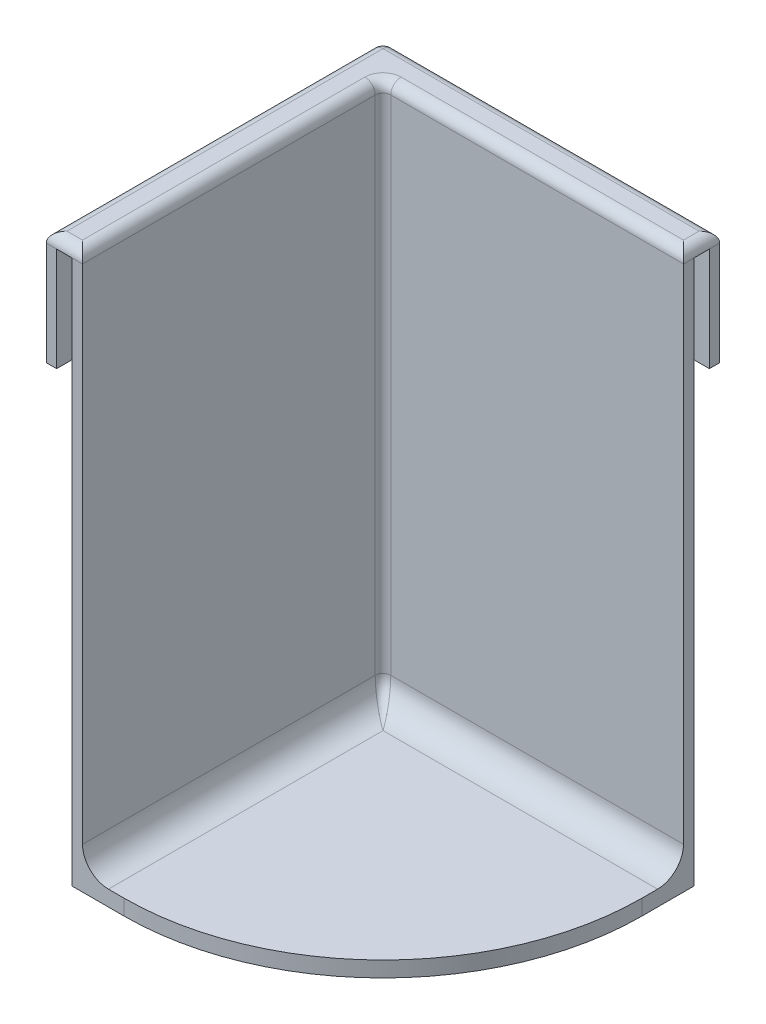
ISO-10303-21;
HEADER;
FILE_DESCRIPTION(('STEP AP214'),'2;1');
FILE_NAME('part.step','',(''),(''),'','','');
FILE_SCHEMA(('AUTOMOTIVE_DESIGN { 1 0 10303 214 1 1 1 1 }'));
ENDSEC;
DATA;
#1=APPLICATION_CONTEXT('core data for automotive mechanical design processes');
#2=APPLICATION_PROTOCOL_DEFINITION('international standard','automotive_design',2000,#1);
#3=PRODUCT_CONTEXT('',#1,'mechanical');
#4=PRODUCT('Part','Part','',(#3));
#5=PRODUCT_RELATED_PRODUCT_CATEGORY('part','',(#4));
#6=PRODUCT_DEFINITION_FORMATION('','',#4);
#7=PRODUCT_DEFINITION_CONTEXT('part definition',#1,'design');
#8=PRODUCT_DEFINITION('design','',#6,#7);
#9=PRODUCT_DEFINITION_SHAPE('','',#8);
#10=(LENGTH_UNIT() NAMED_UNIT(*) SI_UNIT(.MILLI.,.METRE.));
#11=(NAMED_UNIT(*) PLANE_ANGLE_UNIT() SI_UNIT($,.RADIAN.));
#12=(NAMED_UNIT(*) SI_UNIT($,.STERADIAN.) SOLID_ANGLE_UNIT());
#13=UNCERTAINTY_MEASURE_WITH_UNIT(LENGTH_MEASURE(1.E-05),#10,'distance_accuracy_value','');
#14=(GEOMETRIC_REPRESENTATION_CONTEXT(3) GLOBAL_UNCERTAINTY_ASSIGNED_CONTEXT((#13)) GLOBAL_UNIT_ASSIGNED_CONTEXT((#10,
#11,#12)) REPRESENTATION_CONTEXT('',''));
#15=CARTESIAN_POINT('',(0.,0.,0.));
#16=DIRECTION('',(0.,0.,1.));
#17=DIRECTION('',(1.,0.,0.));
#18=AXIS2_PLACEMENT_3D('',#15,#16,#17);
#19=CARTESIAN_POINT('',(-30.,3.,30.));
#20=DIRECTION('',(0.,0.,-1.));
#21=DIRECTION('',(-1.,0.,0.));
#22=AXIS2_PLACEMENT_3D('',#19,#20,#21);
#23=PLANE('',#22);
#24=DIRECTION('',(0.,-1.,0.));
#25=VECTOR('',#24,1.);
#26=CARTESIAN_POINT('',(-28.,105.,30.));
#27=LINE('',#26,#25);
#28=CARTESIAN_POINT('',(-28.,105.,30.));
#29=VERTEX_POINT('',#28);
#30=CARTESIAN_POINT('',(-28.,7.99999999999999,30.));
#31=VERTEX_POINT('',#30);
#32=EDGE_CURVE('E262',#29,#31,#27,.T.);
#33=ORIENTED_EDGE('',*,*,#32,.F.);
#34=DIRECTION('',(1.,0.,0.));
#35=VECTOR('',#34,1.);
#36=CARTESIAN_POINT('',(-35.,105.,30.));
#37=LINE('',#36,#35);
#38=CARTESIAN_POINT('',(-30.,105.,30.));
#39=VERTEX_POINT('',#38);
#40=EDGE_CURVE('E379',#29,#39,#37,.F.);
#41=ORIENTED_EDGE('',*,*,#40,.T.);
#42=DIRECTION('',(0.,-1.,0.));
#43=VECTOR('',#42,1.);
#44=CARTESIAN_POINT('',(-30.,3.,30.));
#45=LINE('',#44,#43);
#46=CARTESIAN_POINT('',(-30.,0.,30.));
#47=VERTEX_POINT('',#46);
#48=EDGE_CURVE('E301',#39,#47,#45,.T.);
#49=ORIENTED_EDGE('',*,*,#48,.T.);
#50=DIRECTION('',(1.,0.,0.));
#51=VECTOR('',#50,1.);
#52=CARTESIAN_POINT('',(-30.,0.,30.));
#53=LINE('',#52,#51);
#54=CARTESIAN_POINT('',(-20.0000000000004,0.,30.));
#55=VERTEX_POINT('',#54);
#56=EDGE_CURVE('E289',#47,#55,#53,.T.);
#57=ORIENTED_EDGE('',*,*,#56,.T.);
#58=DIRECTION('',(0.,-1.,0.));
#59=VECTOR('',#58,1.);
#60=CARTESIAN_POINT('',(-20.0000000000004,3.,30.));
#61=LINE('',#60,#59);
#62=CARTESIAN_POINT('',(-20.0000000000004,3.,30.));
#63=VERTEX_POINT('',#62);
#64=EDGE_CURVE('E297',#63,#55,#61,.T.);
#65=ORIENTED_EDGE('',*,*,#64,.F.);
#66=DIRECTION('',(1.,0.,0.));
#67=VECTOR('',#66,1.);
#68=CARTESIAN_POINT('',(-30.,3.,30.));
#69=LINE('',#68,#67);
#70=CARTESIAN_POINT('',(-23.,3.,30.));
#71=VERTEX_POINT('',#70);
#72=EDGE_CURVE('E271',#71,#63,#69,.T.);
#73=ORIENTED_EDGE('',*,*,#72,.F.);
#74=CARTESIAN_POINT('',(-23.,7.99999999999999,30.));
#75=DIRECTION('',(0.,0.,-1.));
#76=DIRECTION('',(-1.,0.,0.));
#77=AXIS2_PLACEMENT_3D('',#74,#75,#76);
#78=CIRCLE('',#77,5.);
#79=EDGE_CURVE('E58',#71,#31,#78,.T.);
#80=ORIENTED_EDGE('',*,*,#79,.T.);
#81=EDGE_LOOP('',(#33,#41,#49,#57,#65,#73,#80));
#82=FACE_BOUND('',#81,.T.);
#83=ADVANCED_FACE('F47',(#82),#23,.F.);
#84=CARTESIAN_POINT('',(30.,3.,-30.));
#85=DIRECTION('',(-1.,0.,0.));
#86=DIRECTION('',(0.,0.,1.));
#87=AXIS2_PLACEMENT_3D('',#84,#85,#86);
#88=PLANE('',#87);
#89=DIRECTION('',(0.,-1.,0.));
#90=VECTOR('',#89,1.);
#91=CARTESIAN_POINT('',(30.,107.,-35.));
#92=LINE('',#91,#90);
#93=CARTESIAN_POINT('',(30.,105.,-35.));
#94=VERTEX_POINT('',#93);
#95=CARTESIAN_POINT('',(30.,85.,-35.));
#96=VERTEX_POINT('',#95);
#97=EDGE_CURVE('E248',#94,#96,#92,.T.);
#98=ORIENTED_EDGE('',*,*,#97,.F.);
#99=DIRECTION('',(0.,0.,-1.));
#100=VECTOR('',#99,1.);
#101=CARTESIAN_POINT('',(30.,105.,-28.));
#102=LINE('',#101,#100);
#103=CARTESIAN_POINT('',(30.,105.,-33.));
#104=VERTEX_POINT('',#103);
#105=EDGE_CURVE('E230',#94,#104,#102,.F.);
#106=ORIENTED_EDGE('',*,*,#105,.T.);
#107=DIRECTION('',(0.,1.,0.));
#108=VECTOR('',#107,1.);
#109=CARTESIAN_POINT('',(30.,85.,-33.));
#110=LINE('',#109,#108);
#111=CARTESIAN_POINT('',(30.,85.,-33.));
#112=VERTEX_POINT('',#111);
#113=EDGE_CURVE('E206',#112,#104,#110,.T.);
#114=ORIENTED_EDGE('',*,*,#113,.F.);
#115=DIRECTION('',(0.,0.,1.));
#116=VECTOR('',#115,1.);
#117=CARTESIAN_POINT('',(30.,85.,-33.));
#118=LINE('',#117,#116);
#119=EDGE_CURVE('E214',#96,#112,#118,.T.);
#120=ORIENTED_EDGE('',*,*,#119,.F.);
#121=EDGE_LOOP('',(#98,#106,#114,#120));
#122=FACE_BOUND('',#121,.T.);
#123=ADVANCED_FACE('F228',(#122),#88,.F.);
#124=CARTESIAN_POINT('',(-26.5,105.,-26.5));
#125=DIRECTION('',(0.,1.,0.));
#126=DIRECTION('',(0.,0.,1.));
#127=AXIS2_PLACEMENT_3D('',#124,#125,#126);
#128=PLANE('',#127);
#129=DIRECTION('',(-1.,0.,0.));
#130=VECTOR('',#129,1.);
#131=CARTESIAN_POINT('',(30.,105.,-33.));
#132=LINE('',#131,#130);
#133=CARTESIAN_POINT('',(-33.,105.,-33.));
#134=VERTEX_POINT('',#133);
#135=EDGE_CURVE('E424',#104,#134,#132,.T.);
#136=ORIENTED_EDGE('',*,*,#135,.F.);
#137=DIRECTION('',(0.,0.,-1.));
#138=VECTOR('',#137,1.);
#139=CARTESIAN_POINT('',(30.,105.,-28.));
#140=LINE('',#139,#138);
#141=CARTESIAN_POINT('',(30.,105.,-30.));
#142=VERTEX_POINT('',#141);
#143=EDGE_CURVE('E232',#142,#104,#140,.T.);
#144=ORIENTED_EDGE('',*,*,#143,.F.);
#145=DIRECTION('',(-1.,0.,0.));
#146=VECTOR('',#145,1.);
#147=CARTESIAN_POINT('',(-30.,105.,-30.));
#148=LINE('',#147,#146);
#149=CARTESIAN_POINT('',(-27.,105.,-30.));
#150=VERTEX_POINT('',#149);
#151=EDGE_CURVE('E251',#142,#150,#148,.T.);
#152=ORIENTED_EDGE('',*,*,#151,.T.);
#153=CARTESIAN_POINT('',(-27.,105.,-27.));
#154=DIRECTION('',(0.,-1.,0.));
#155=DIRECTION('',(0.,0.,-1.));
#156=AXIS2_PLACEMENT_3D('',#153,#154,#155);
#157=CIRCLE('',#156,3.);
#158=CARTESIAN_POINT('',(-30.,105.,-27.));
#159=VERTEX_POINT('',#158);
#160=EDGE_CURVE('E319',#150,#159,#157,.F.);
#161=ORIENTED_EDGE('',*,*,#160,.T.);
#162=DIRECTION('',(0.,0.,1.));
#163=VECTOR('',#162,1.);
#164=CARTESIAN_POINT('',(-30.,105.,30.));
#165=LINE('',#164,#163);
#166=EDGE_CURVE('E255',#159,#39,#165,.T.);
#167=ORIENTED_EDGE('',*,*,#166,.T.);
#168=DIRECTION('',(1.,0.,0.));
#169=VECTOR('',#168,1.);
#170=CARTESIAN_POINT('',(-28.,105.,30.));
#171=LINE('',#170,#169);
#172=CARTESIAN_POINT('',(-33.,105.,30.));
#173=VERTEX_POINT('',#172);
#174=EDGE_CURVE('E236',#173,#39,#171,.T.);
#175=ORIENTED_EDGE('',*,*,#174,.F.);
#176=DIRECTION('',(0.,0.,1.));
#177=VECTOR('',#176,1.);
#178=CARTESIAN_POINT('',(-33.,105.,-33.));
#179=LINE('',#178,#177);
#180=EDGE_CURVE('E225',#134,#173,#179,.T.);
#181=ORIENTED_EDGE('',*,*,#180,.F.);
#182=EDGE_LOOP('',(#136,#144,#152,#161,#167,#175,#181));
#183=FACE_BOUND('',#182,.T.);
#184=ADVANCED_FACE('F511',(#183),#128,.F.);
#185=DIRECTION('',(0.,-1.,0.));
#186=VECTOR('',#185,1.);
#187=CARTESIAN_POINT('',(30.,3.,-30.));
#188=LINE('',#187,#186);
#189=CARTESIAN_POINT('',(30.,0.,-30.));
#190=VERTEX_POINT('',#189);
#191=EDGE_CURVE('E305',#142,#190,#188,.T.);
#192=ORIENTED_EDGE('',*,*,#191,.F.);
#193=DIRECTION('',(0.,0.,-1.));
#194=VECTOR('',#193,1.);
#195=CARTESIAN_POINT('',(30.,105.,-28.));
#196=LINE('',#195,#194);
#197=CARTESIAN_POINT('',(30.,105.,-28.));
#198=VERTEX_POINT('',#197);
#199=EDGE_CURVE('E361',#142,#198,#196,.F.);
#200=ORIENTED_EDGE('',*,*,#199,.T.);
#201=DIRECTION('',(0.,-1.,0.));
#202=VECTOR('',#201,1.);
#203=CARTESIAN_POINT('',(30.,105.,-28.));
#204=LINE('',#203,#202);
#205=CARTESIAN_POINT('',(30.,7.99999999999999,-28.));
#206=VERTEX_POINT('',#205);
#207=EDGE_CURVE('E259',#198,#206,#204,.T.);
#208=ORIENTED_EDGE('',*,*,#207,.T.);
#209=CARTESIAN_POINT('',(30.,7.99999999999999,-23.));
#210=DIRECTION('',(-1.,0.,0.));
#211=DIRECTION('',(0.,0.,1.));
#212=AXIS2_PLACEMENT_3D('',#209,#210,#211);
#213=CIRCLE('',#212,5.);
#214=CARTESIAN_POINT('',(30.,3.,-23.));
#215=VERTEX_POINT('',#214);
#216=EDGE_CURVE('E11',#206,#215,#213,.T.);
#217=ORIENTED_EDGE('',*,*,#216,.T.);
#218=DIRECTION('',(0.,0.,-1.));
#219=VECTOR('',#218,1.);
#220=CARTESIAN_POINT('',(30.,3.,-30.));
#221=LINE('',#220,#219);
#222=CARTESIAN_POINT('',(30.,3.,-20.0000000000004));
#223=VERTEX_POINT('',#222);
#224=EDGE_CURVE('E267',#223,#215,#221,.T.);
#225=ORIENTED_EDGE('',*,*,#224,.F.);
#226=DIRECTION('',(0.,-1.,0.));
#227=VECTOR('',#226,1.);
#228=CARTESIAN_POINT('',(30.,3.,-20.0000000000004));
#229=LINE('',#228,#227);
#230=CARTESIAN_POINT('',(30.,0.,-20.0000000000004));
#231=VERTEX_POINT('',#230);
#232=EDGE_CURVE('E278',#223,#231,#229,.T.);
#233=ORIENTED_EDGE('',*,*,#232,.T.);
#234=DIRECTION('',(0.,0.,-1.));
#235=VECTOR('',#234,1.);
#236=CARTESIAN_POINT('',(30.,0.,-30.));
#237=LINE('',#236,#235);
#238=EDGE_CURVE('E266',#231,#190,#237,.T.);
#239=ORIENTED_EDGE('',*,*,#238,.T.);
#240=EDGE_LOOP('',(#192,#200,#208,#217,#225,#233,#239));
#241=FACE_BOUND('',#240,.T.);
#242=ADVANCED_FACE('F470',(#241),#88,.F.);
#243=CARTESIAN_POINT('',(-30.,3.,-30.));
#244=DIRECTION('',(0.,0.,1.));
#245=DIRECTION('',(1.,0.,0.));
#246=AXIS2_PLACEMENT_3D('',#243,#244,#245);
#247=PLANE('',#246);
#248=DIRECTION('',(-1.,0.,0.));
#249=VECTOR('',#248,1.);
#250=CARTESIAN_POINT('',(-30.,0.,-30.));
#251=LINE('',#250,#249);
#252=CARTESIAN_POINT('',(-27.,0.,-30.));
#253=VERTEX_POINT('',#252);
#254=EDGE_CURVE('E282',#190,#253,#251,.T.);
#255=ORIENTED_EDGE('',*,*,#254,.T.);
#256=DIRECTION('',(0.,-1.,0.));
#257=VECTOR('',#256,1.);
#258=CARTESIAN_POINT('',(-27.,3.,-30.));
#259=LINE('',#258,#257);
#260=EDGE_CURVE('E316',#253,#150,#259,.F.);
#261=ORIENTED_EDGE('',*,*,#260,.T.);
#262=ORIENTED_EDGE('',*,*,#151,.F.);
#263=ORIENTED_EDGE('',*,*,#191,.T.);
#264=EDGE_LOOP('',(#255,#261,#262,#263));
#265=FACE_BOUND('',#264,.T.);
#266=ADVANCED_FACE('F523',(#265),#247,.F.);
#267=CARTESIAN_POINT('',(-30.,3.,-30.));
#268=DIRECTION('',(1.,0.,0.));
#269=DIRECTION('',(0.,0.,-1.));
#270=AXIS2_PLACEMENT_3D('',#267,#268,#269);
#271=PLANE('',#270);
#272=ORIENTED_EDGE('',*,*,#166,.F.);
#273=DIRECTION('',(0.,-1.,0.));
#274=VECTOR('',#273,1.);
#275=CARTESIAN_POINT('',(-30.,3.,-27.));
#276=LINE('',#275,#274);
#277=CARTESIAN_POINT('',(-30.,0.,-27.));
#278=VERTEX_POINT('',#277);
#279=EDGE_CURVE('E309',#159,#278,#276,.T.);
#280=ORIENTED_EDGE('',*,*,#279,.T.);
#281=DIRECTION('',(0.,0.,1.));
#282=VECTOR('',#281,1.);
#283=CARTESIAN_POINT('',(-30.,0.,-30.));
#284=LINE('',#283,#282);
#285=EDGE_CURVE('E286',#278,#47,#284,.T.);
#286=ORIENTED_EDGE('',*,*,#285,.T.);
#287=ORIENTED_EDGE('',*,*,#48,.F.);
#288=EDGE_LOOP('',(#272,#280,#286,#287));
#289=FACE_BOUND('',#288,.T.);
#290=ADVANCED_FACE('F515',(#289),#271,.F.);
#291=DIRECTION('',(0.,1.,0.));
#292=VECTOR('',#291,1.);
#293=CARTESIAN_POINT('',(-33.,85.,30.));
#294=LINE('',#293,#292);
#295=CARTESIAN_POINT('',(-33.,85.,30.));
#296=VERTEX_POINT('',#295);
#297=EDGE_CURVE('E238',#296,#173,#294,.T.);
#298=ORIENTED_EDGE('',*,*,#297,.T.);
#299=DIRECTION('',(1.,0.,0.));
#300=VECTOR('',#299,1.);
#301=CARTESIAN_POINT('',(-35.,105.,30.));
#302=LINE('',#301,#300);
#303=CARTESIAN_POINT('',(-35.,105.,30.));
#304=VERTEX_POINT('',#303);
#305=EDGE_CURVE('E376',#173,#304,#302,.F.);
#306=ORIENTED_EDGE('',*,*,#305,.T.);
#307=DIRECTION('',(0.,-1.,0.));
#308=VECTOR('',#307,1.);
#309=CARTESIAN_POINT('',(-35.,107.,30.));
#310=LINE('',#309,#308);
#311=CARTESIAN_POINT('',(-35.,85.,30.));
#312=VERTEX_POINT('',#311);
#313=EDGE_CURVE('E245',#304,#312,#310,.T.);
#314=ORIENTED_EDGE('',*,*,#313,.T.);
#315=DIRECTION('',(-1.,0.,0.));
#316=VECTOR('',#315,1.);
#317=CARTESIAN_POINT('',(-35.,85.,30.));
#318=LINE('',#317,#316);
#319=EDGE_CURVE('E549',#296,#312,#318,.T.);
#320=ORIENTED_EDGE('',*,*,#319,.F.);
#321=EDGE_LOOP('',(#298,#306,#314,#320));
#322=FACE_BOUND('',#321,.T.);
#323=ADVANCED_FACE('F565',(#322),#23,.F.);
#324=CARTESIAN_POINT('',(-20.,3.,-20.));
#325=DIRECTION('',(0.,-1.,0.));
#326=DIRECTION('',(0.,0.,-1.));
#327=AXIS2_PLACEMENT_3D('',#324,#325,#326);
#328=CYLINDRICAL_SURFACE('',#327,50.);
#329=CARTESIAN_POINT('',(-20.,0.,-20.));
#330=DIRECTION('',(0.,1.,0.));
#331=DIRECTION('',(0.,0.,1.));
#332=AXIS2_PLACEMENT_3D('',#329,#330,#331);
#333=CIRCLE('',#332,50.);
#334=EDGE_CURVE('E272',#55,#231,#333,.T.);
#335=ORIENTED_EDGE('',*,*,#334,.T.);
#336=ORIENTED_EDGE('',*,*,#232,.F.);
#337=CARTESIAN_POINT('',(-20.,3.,-20.));
#338=DIRECTION('',(0.,1.,0.));
#339=DIRECTION('',(0.,0.,1.));
#340=AXIS2_PLACEMENT_3D('',#337,#338,#339);
#341=CIRCLE('',#340,50.);
#342=EDGE_CURVE('E275',#63,#223,#341,.T.);
#343=ORIENTED_EDGE('',*,*,#342,.F.);
#344=ORIENTED_EDGE('',*,*,#64,.T.);
#345=EDGE_LOOP('',(#335,#336,#343,#344));
#346=FACE_BOUND('',#345,.T.);
#347=ADVANCED_FACE('F467',(#346),#328,.T.);
#348=CARTESIAN_POINT('',(-20.,3.,-20.));
#349=DIRECTION('',(0.,1.,0.));
#350=DIRECTION('',(0.,0.,1.));
#351=AXIS2_PLACEMENT_3D('',#348,#349,#350);
#352=PLANE('',#351);
#353=DIRECTION('',(1.,0.,0.));
#354=VECTOR('',#353,1.);
#355=CARTESIAN_POINT('',(-20.,3.,-23.));
#356=LINE('',#355,#354);
#357=CARTESIAN_POINT('',(-23.,3.,-23.));
#358=VERTEX_POINT('',#357);
#359=EDGE_CURVE('E428',#215,#358,#356,.F.);
#360=ORIENTED_EDGE('',*,*,#359,.T.);
#361=DIRECTION('',(0.,0.,-1.));
#362=VECTOR('',#361,1.);
#363=CARTESIAN_POINT('',(-23.,3.,-20.));
#364=LINE('',#363,#362);
#365=EDGE_CURVE('E431',#358,#71,#364,.F.);
#366=ORIENTED_EDGE('',*,*,#365,.T.);
#367=ORIENTED_EDGE('',*,*,#72,.T.);
#368=ORIENTED_EDGE('',*,*,#342,.T.);
#369=ORIENTED_EDGE('',*,*,#224,.T.);
#370=EDGE_LOOP('',(#360,#366,#367,#368,#369));
#371=FACE_BOUND('',#370,.T.);
#372=ADVANCED_FACE('F458',(#371),#352,.T.);
#373=CARTESIAN_POINT('',(-20.,0.,-20.));
#374=DIRECTION('',(0.,1.,0.));
#375=DIRECTION('',(0.,0.,1.));
#376=AXIS2_PLACEMENT_3D('',#373,#374,#375);
#377=PLANE('',#376);
#378=ORIENTED_EDGE('',*,*,#285,.F.);
#379=CARTESIAN_POINT('',(-27.,0.,-27.));
#380=DIRECTION('',(0.,1.,0.));
#381=DIRECTION('',(0.,0.,1.));
#382=AXIS2_PLACEMENT_3D('',#379,#380,#381);
#383=CIRCLE('',#382,3.);
#384=EDGE_CURVE('E313',#278,#253,#383,.F.);
#385=ORIENTED_EDGE('',*,*,#384,.T.);
#386=ORIENTED_EDGE('',*,*,#254,.F.);
#387=ORIENTED_EDGE('',*,*,#238,.F.);
#388=ORIENTED_EDGE('',*,*,#334,.F.);
#389=ORIENTED_EDGE('',*,*,#56,.F.);
#390=EDGE_LOOP('',(#378,#385,#386,#387,#388,#389));
#391=FACE_BOUND('',#390,.T.);
#392=ADVANCED_FACE('F521',(#391),#377,.F.);
#393=CARTESIAN_POINT('',(-28.,105.,30.));
#394=DIRECTION('',(-1.,0.,0.));
#395=DIRECTION('',(0.,0.,1.));
#396=AXIS2_PLACEMENT_3D('',#393,#394,#395);
#397=PLANE('',#396);
#398=ORIENTED_EDGE('',*,*,#32,.T.);
#399=DIRECTION('',(0.,0.,-1.));
#400=VECTOR('',#399,1.);
#401=CARTESIAN_POINT('',(-28.,7.99999999999999,30.));
#402=LINE('',#401,#400);
#403=CARTESIAN_POINT('',(-28.,7.99999999999999,-26.5));
#404=VERTEX_POINT('',#403);
#405=EDGE_CURVE('E391',#31,#404,#402,.T.);
#406=ORIENTED_EDGE('',*,*,#405,.T.);
#407=DIRECTION('',(0.,-1.,0.));
#408=VECTOR('',#407,1.);
#409=CARTESIAN_POINT('',(-28.,105.,-26.5));
#410=LINE('',#409,#408);
#411=CARTESIAN_POINT('',(-28.,105.,-26.5));
#412=VERTEX_POINT('',#411);
#413=EDGE_CURVE('E326',#404,#412,#410,.F.);
#414=ORIENTED_EDGE('',*,*,#413,.T.);
#415=DIRECTION('',(0.,0.,-1.));
#416=VECTOR('',#415,1.);
#417=CARTESIAN_POINT('',(-28.,105.,30.));
#418=LINE('',#417,#416);
#419=EDGE_CURVE('E373',#412,#29,#418,.F.);
#420=ORIENTED_EDGE('',*,*,#419,.T.);
#421=EDGE_LOOP('',(#398,#406,#414,#420));
#422=FACE_BOUND('',#421,.T.);
#423=ADVANCED_FACE('F500',(#422),#397,.F.);
#424=CARTESIAN_POINT('',(-28.,105.,-28.));
#425=DIRECTION('',(0.,0.,-1.));
#426=DIRECTION('',(-1.,0.,0.));
#427=AXIS2_PLACEMENT_3D('',#424,#425,#426);
#428=PLANE('',#427);
#429=DIRECTION('',(0.,-1.,0.));
#430=VECTOR('',#429,1.);
#431=CARTESIAN_POINT('',(-26.5,3.,-28.));
#432=LINE('',#431,#430);
#433=CARTESIAN_POINT('',(-26.5,105.,-28.));
#434=VERTEX_POINT('',#433);
#435=CARTESIAN_POINT('',(-26.5,7.99999999999999,-28.));
#436=VERTEX_POINT('',#435);
#437=EDGE_CURVE('E323',#434,#436,#432,.T.);
#438=ORIENTED_EDGE('',*,*,#437,.T.);
#439=DIRECTION('',(1.,0.,0.));
#440=VECTOR('',#439,1.);
#441=CARTESIAN_POINT('',(-28.,7.99999999999999,-28.));
#442=LINE('',#441,#440);
#443=EDGE_CURVE('E66',#436,#206,#442,.T.);
#444=ORIENTED_EDGE('',*,*,#443,.T.);
#445=ORIENTED_EDGE('',*,*,#207,.F.);
#446=DIRECTION('',(1.,0.,0.));
#447=VECTOR('',#446,1.);
#448=CARTESIAN_POINT('',(-26.5,105.,-28.));
#449=LINE('',#448,#447);
#450=EDGE_CURVE('E366',#198,#434,#449,.F.);
#451=ORIENTED_EDGE('',*,*,#450,.T.);
#452=EDGE_LOOP('',(#438,#444,#445,#451));
#453=FACE_BOUND('',#452,.T.);
#454=ADVANCED_FACE('F474',(#453),#428,.F.);
#455=CARTESIAN_POINT('',(-27.,3.,-27.));
#456=DIRECTION('',(0.,-1.,0.));
#457=DIRECTION('',(0.,0.,-1.));
#458=AXIS2_PLACEMENT_3D('',#455,#456,#457);
#459=CYLINDRICAL_SURFACE('',#458,3.);
#460=ORIENTED_EDGE('',*,*,#160,.F.);
#461=ORIENTED_EDGE('',*,*,#260,.F.);
#462=ORIENTED_EDGE('',*,*,#384,.F.);
#463=ORIENTED_EDGE('',*,*,#279,.F.);
#464=EDGE_LOOP('',(#460,#461,#462,#463));
#465=FACE_BOUND('',#464,.T.);
#466=ADVANCED_FACE('F518',(#465),#459,.T.);
#467=CARTESIAN_POINT('',(-26.5,105.,-26.5));
#468=DIRECTION('',(0.,1.,0.));
#469=DIRECTION('',(0.,0.,1.));
#470=AXIS2_PLACEMENT_3D('',#467,#468,#469);
#471=CYLINDRICAL_SURFACE('',#470,1.5);
#472=ORIENTED_EDGE('',*,*,#413,.F.);
#473=CARTESIAN_POINT('',(-26.5,7.99999999999999,-26.5));
#474=DIRECTION('',(0.,-1.,0.));
#475=DIRECTION('',(0.,0.,-1.));
#476=AXIS2_PLACEMENT_3D('',#473,#474,#475);
#477=CIRCLE('',#476,1.5);
#478=EDGE_CURVE('E74',#404,#436,#477,.T.);
#479=ORIENTED_EDGE('',*,*,#478,.T.);
#480=ORIENTED_EDGE('',*,*,#437,.F.);
#481=CARTESIAN_POINT('',(-26.5,105.,-26.5));
#482=DIRECTION('',(0.,1.,0.));
#483=DIRECTION('',(0.,0.,1.));
#484=AXIS2_PLACEMENT_3D('',#481,#482,#483);
#485=CIRCLE('',#484,1.5);
#486=EDGE_CURVE('E369',#434,#412,#485,.T.);
#487=ORIENTED_EDGE('',*,*,#486,.T.);
#488=EDGE_LOOP('',(#472,#479,#480,#487));
#489=FACE_BOUND('',#488,.T.);
#490=ADVANCED_FACE('F495',(#489),#471,.F.);
#491=CARTESIAN_POINT('',(30.,107.,-35.));
#492=DIRECTION('',(0.,0.,1.));
#493=DIRECTION('',(1.,0.,0.));
#494=AXIS2_PLACEMENT_3D('',#491,#492,#493);
#495=PLANE('',#494);
#496=DIRECTION('',(0.,-1.,0.));
#497=VECTOR('',#496,1.);
#498=CARTESIAN_POINT('',(-33.,107.,-35.));
#499=LINE('',#498,#497);
#500=CARTESIAN_POINT('',(-33.,85.,-35.));
#501=VERTEX_POINT('',#500);
#502=CARTESIAN_POINT('',(-33.,105.,-35.));
#503=VERTEX_POINT('',#502);
#504=EDGE_CURVE('E335',#501,#503,#499,.F.);
#505=ORIENTED_EDGE('',*,*,#504,.T.);
#506=DIRECTION('',(-1.,0.,0.));
#507=VECTOR('',#506,1.);
#508=CARTESIAN_POINT('',(30.,105.,-35.));
#509=LINE('',#508,#507);
#510=EDGE_CURVE('E388',#503,#94,#509,.F.);
#511=ORIENTED_EDGE('',*,*,#510,.T.);
#512=ORIENTED_EDGE('',*,*,#97,.T.);
#513=DIRECTION('',(1.,0.,0.));
#514=VECTOR('',#513,1.);
#515=CARTESIAN_POINT('',(30.,85.,-35.));
#516=LINE('',#515,#514);
#517=EDGE_CURVE('E221',#501,#96,#516,.T.);
#518=ORIENTED_EDGE('',*,*,#517,.F.);
#519=EDGE_LOOP('',(#505,#511,#512,#518));
#520=FACE_BOUND('',#519,.T.);
#521=ADVANCED_FACE('F603',(#520),#495,.F.);
#522=CARTESIAN_POINT('',(-35.,107.,30.));
#523=DIRECTION('',(1.,0.,0.));
#524=DIRECTION('',(0.,0.,-1.));
#525=AXIS2_PLACEMENT_3D('',#522,#523,#524);
#526=PLANE('',#525);
#527=ORIENTED_EDGE('',*,*,#313,.F.);
#528=DIRECTION('',(0.,0.,1.));
#529=VECTOR('',#528,1.);
#530=CARTESIAN_POINT('',(-35.,105.,-32.9999999999999));
#531=LINE('',#530,#529);
#532=CARTESIAN_POINT('',(-35.,105.,-32.9999999999999));
#533=VERTEX_POINT('',#532);
#534=EDGE_CURVE('E382',#304,#533,#531,.F.);
#535=ORIENTED_EDGE('',*,*,#534,.T.);
#536=DIRECTION('',(0.,-1.,0.));
#537=VECTOR('',#536,1.);
#538=CARTESIAN_POINT('',(-35.,107.,-32.9999999999999));
#539=LINE('',#538,#537);
#540=CARTESIAN_POINT('',(-35.,85.,-32.9999999999999));
#541=VERTEX_POINT('',#540);
#542=EDGE_CURVE('E329',#533,#541,#539,.T.);
#543=ORIENTED_EDGE('',*,*,#542,.T.);
#544=DIRECTION('',(0.,0.,-1.));
#545=VECTOR('',#544,1.);
#546=CARTESIAN_POINT('',(-35.,85.,-35.));
#547=LINE('',#546,#545);
#548=EDGE_CURVE('E547',#312,#541,#547,.T.);
#549=ORIENTED_EDGE('',*,*,#548,.F.);
#550=EDGE_LOOP('',(#527,#535,#543,#549));
#551=FACE_BOUND('',#550,.T.);
#552=ADVANCED_FACE('F540',(#551),#526,.F.);
#553=CARTESIAN_POINT('',(-26.5,107.,-26.5));
#554=DIRECTION('',(0.,1.,0.));
#555=DIRECTION('',(0.,0.,1.));
#556=AXIS2_PLACEMENT_3D('',#553,#554,#555);
#557=PLANE('',#556);
#558=DIRECTION('',(1.,0.,0.));
#559=VECTOR('',#558,1.);
#560=CARTESIAN_POINT('',(30.,107.,-30.));
#561=LINE('',#560,#559);
#562=CARTESIAN_POINT('',(-26.5,107.,-30.));
#563=VERTEX_POINT('',#562);
#564=CARTESIAN_POINT('',(28.,107.,-30.));
#565=VERTEX_POINT('',#564);
#566=EDGE_CURVE('E354',#563,#565,#561,.T.);
#567=ORIENTED_EDGE('',*,*,#566,.T.);
#568=DIRECTION('',(0.,0.,-1.));
#569=VECTOR('',#568,1.);
#570=CARTESIAN_POINT('',(28.,107.,-35.));
#571=LINE('',#570,#569);
#572=CARTESIAN_POINT('',(28.,107.,-33.));
#573=VERTEX_POINT('',#572);
#574=EDGE_CURVE('E357',#565,#573,#571,.T.);
#575=ORIENTED_EDGE('',*,*,#574,.T.);
#576=DIRECTION('',(-1.,0.,0.));
#577=VECTOR('',#576,1.);
#578=CARTESIAN_POINT('',(-33.,107.,-32.9999999999999));
#579=LINE('',#578,#577);
#580=CARTESIAN_POINT('',(-33.,107.,-32.9999999999999));
#581=VERTEX_POINT('',#580);
#582=EDGE_CURVE('E339',#573,#581,#579,.T.);
#583=ORIENTED_EDGE('',*,*,#582,.T.);
#584=DIRECTION('',(0.,0.,1.));
#585=VECTOR('',#584,1.);
#586=CARTESIAN_POINT('',(-33.,107.,30.));
#587=LINE('',#586,#585);
#588=CARTESIAN_POINT('',(-33.,107.,28.));
#589=VERTEX_POINT('',#588);
#590=EDGE_CURVE('E342',#581,#589,#587,.T.);
#591=ORIENTED_EDGE('',*,*,#590,.T.);
#592=DIRECTION('',(1.,0.,0.));
#593=VECTOR('',#592,1.);
#594=CARTESIAN_POINT('',(-28.,107.,28.));
#595=LINE('',#594,#593);
#596=CARTESIAN_POINT('',(-30.,107.,28.));
#597=VERTEX_POINT('',#596);
#598=EDGE_CURVE('E345',#589,#597,#595,.T.);
#599=ORIENTED_EDGE('',*,*,#598,.T.);
#600=DIRECTION('',(0.,0.,-1.));
#601=VECTOR('',#600,1.);
#602=CARTESIAN_POINT('',(-30.,107.,-26.5));
#603=LINE('',#602,#601);
#604=CARTESIAN_POINT('',(-30.,107.,-26.5));
#605=VERTEX_POINT('',#604);
#606=EDGE_CURVE('E348',#597,#605,#603,.T.);
#607=ORIENTED_EDGE('',*,*,#606,.T.);
#608=CARTESIAN_POINT('',(-26.5,107.,-26.5));
#609=DIRECTION('',(0.,1.,0.));
#610=DIRECTION('',(0.,0.,1.));
#611=AXIS2_PLACEMENT_3D('',#608,#609,#610);
#612=CIRCLE('',#611,3.5);
#613=EDGE_CURVE('E351',#605,#563,#612,.F.);
#614=ORIENTED_EDGE('',*,*,#613,.T.);
#615=EDGE_LOOP('',(#567,#575,#583,#591,#599,#607,#614));
#616=FACE_BOUND('',#615,.T.);
#617=ADVANCED_FACE('F486',(#616),#557,.T.);
#618=CARTESIAN_POINT('',(30.,85.,-33.));
#619=DIRECTION('',(0.,0.,-1.));
#620=DIRECTION('',(-1.,0.,0.));
#621=AXIS2_PLACEMENT_3D('',#618,#619,#620);
#622=PLANE('',#621);
#623=ORIENTED_EDGE('',*,*,#135,.T.);
#624=DIRECTION('',(0.,1.,0.));
#625=VECTOR('',#624,1.);
#626=CARTESIAN_POINT('',(-33.,85.,-33.));
#627=LINE('',#626,#625);
#628=CARTESIAN_POINT('',(-33.,85.,-33.));
#629=VERTEX_POINT('',#628);
#630=EDGE_CURVE('E209',#629,#134,#627,.T.);
#631=ORIENTED_EDGE('',*,*,#630,.F.);
#632=DIRECTION('',(-1.,0.,0.));
#633=VECTOR('',#632,1.);
#634=CARTESIAN_POINT('',(30.,85.,-33.));
#635=LINE('',#634,#633);
#636=EDGE_CURVE('E202',#112,#629,#635,.T.);
#637=ORIENTED_EDGE('',*,*,#636,.F.);
#638=ORIENTED_EDGE('',*,*,#113,.T.);
#639=EDGE_LOOP('',(#623,#631,#637,#638));
#640=FACE_BOUND('',#639,.T.);
#641=ADVANCED_FACE('F204',(#640),#622,.F.);
#642=CARTESIAN_POINT('',(-33.,85.,-33.));
#643=DIRECTION('',(-1.,0.,0.));
#644=DIRECTION('',(0.,0.,1.));
#645=AXIS2_PLACEMENT_3D('',#642,#643,#644);
#646=PLANE('',#645);
#647=ORIENTED_EDGE('',*,*,#180,.T.);
#648=ORIENTED_EDGE('',*,*,#297,.F.);
#649=DIRECTION('',(0.,0.,1.));
#650=VECTOR('',#649,1.);
#651=CARTESIAN_POINT('',(-33.,85.,-33.));
#652=LINE('',#651,#650);
#653=EDGE_CURVE('E213',#629,#296,#652,.T.);
#654=ORIENTED_EDGE('',*,*,#653,.F.);
#655=ORIENTED_EDGE('',*,*,#630,.T.);
#656=EDGE_LOOP('',(#647,#648,#654,#655));
#657=FACE_BOUND('',#656,.T.);
#658=ADVANCED_FACE('F567',(#657),#646,.F.);
#659=CARTESIAN_POINT('',(0.,85.,0.));
#660=DIRECTION('',(0.,1.,0.));
#661=DIRECTION('',(0.,0.,1.));
#662=AXIS2_PLACEMENT_3D('',#659,#660,#661);
#663=PLANE('',#662);
#664=ORIENTED_EDGE('',*,*,#548,.T.);
#665=CARTESIAN_POINT('',(-33.,85.,-32.9999999999999));
#666=DIRECTION('',(0.,1.,0.));
#667=DIRECTION('',(0.,0.,1.));
#668=AXIS2_PLACEMENT_3D('',#665,#666,#667);
#669=CIRCLE('',#668,2.);
#670=EDGE_CURVE('E332',#541,#501,#669,.F.);
#671=ORIENTED_EDGE('',*,*,#670,.T.);
#672=ORIENTED_EDGE('',*,*,#517,.T.);
#673=ORIENTED_EDGE('',*,*,#119,.T.);
#674=ORIENTED_EDGE('',*,*,#636,.T.);
#675=ORIENTED_EDGE('',*,*,#653,.T.);
#676=ORIENTED_EDGE('',*,*,#319,.T.);
#677=EDGE_LOOP('',(#664,#671,#672,#673,#674,#675,#676));
#678=FACE_BOUND('',#677,.T.);
#679=ADVANCED_FACE('F219',(#678),#663,.F.);
#680=CARTESIAN_POINT('',(-33.,107.,-32.9999999999999));
#681=DIRECTION('',(0.,-1.,0.));
#682=DIRECTION('',(0.,0.,-1.));
#683=AXIS2_PLACEMENT_3D('',#680,#681,#682);
#684=CYLINDRICAL_SURFACE('',#683,2.);
#685=ORIENTED_EDGE('',*,*,#542,.F.);
#686=CARTESIAN_POINT('',(-33.,105.,-32.9999999999999));
#687=DIRECTION('',(0.,-1.,0.));
#688=DIRECTION('',(0.,0.,-1.));
#689=AXIS2_PLACEMENT_3D('',#686,#687,#688);
#690=CIRCLE('',#689,2.);
#691=EDGE_CURVE('E385',#533,#503,#690,.T.);
#692=ORIENTED_EDGE('',*,*,#691,.T.);
#693=ORIENTED_EDGE('',*,*,#504,.F.);
#694=ORIENTED_EDGE('',*,*,#670,.F.);
#695=EDGE_LOOP('',(#685,#692,#693,#694));
#696=FACE_BOUND('',#695,.T.);
#697=ADVANCED_FACE('F544',(#696),#684,.T.);
#698=CARTESIAN_POINT('',(-26.5,105.,28.));
#699=DIRECTION('',(-1.,0.,0.));
#700=DIRECTION('',(0.,0.,1.));
#701=AXIS2_PLACEMENT_3D('',#698,#699,#700);
#702=CYLINDRICAL_SURFACE('',#701,2.);
#703=ORIENTED_EDGE('',*,*,#174,.T.);
#704=ORIENTED_EDGE('',*,*,#40,.F.);
#705=CARTESIAN_POINT('',(-30.,105.,28.));
#706=DIRECTION('',(-0.707106781186547,0.,0.707106781186547));
#707=DIRECTION('',(-0.707106781186547,0.,-0.707106781186547));
#708=AXIS2_PLACEMENT_3D('',#705,#706,#707);
#709=ELLIPSE('',#708,2.82842712474619,2.);
#710=EDGE_CURVE('E420',#597,#29,#709,.F.);
#711=ORIENTED_EDGE('',*,*,#710,.F.);
#712=ORIENTED_EDGE('',*,*,#598,.F.);
#713=CARTESIAN_POINT('',(-33.,105.,28.));
#714=DIRECTION('',(-0.707106781186547,0.,-0.707106781186548));
#715=DIRECTION('',(0.707106781186547,0.,-0.707106781186547));
#716=AXIS2_PLACEMENT_3D('',#713,#714,#715);
#717=ELLIPSE('',#716,2.82842712474619,2.);
#718=EDGE_CURVE('E416',#304,#589,#717,.T.);
#719=ORIENTED_EDGE('',*,*,#718,.F.);
#720=ORIENTED_EDGE('',*,*,#305,.F.);
#721=EDGE_LOOP('',(#703,#704,#711,#712,#719,#720));
#722=FACE_BOUND('',#721,.T.);
#723=ADVANCED_FACE('F504',(#722),#702,.T.);
#724=CARTESIAN_POINT('',(-30.,105.,-26.5));
#725=DIRECTION('',(0.,0.,1.));
#726=DIRECTION('',(1.,0.,0.));
#727=AXIS2_PLACEMENT_3D('',#724,#725,#726);
#728=CYLINDRICAL_SURFACE('',#727,2.);
#729=ORIENTED_EDGE('',*,*,#710,.T.);
#730=ORIENTED_EDGE('',*,*,#419,.F.);
#731=CARTESIAN_POINT('',(-30.,105.,-26.5));
#732=DIRECTION('',(0.,0.,-1.));
#733=DIRECTION('',(-1.,0.,0.));
#734=AXIS2_PLACEMENT_3D('',#731,#732,#733);
#735=CIRCLE('',#734,2.);
#736=EDGE_CURVE('E412',#605,#412,#735,.T.);
#737=ORIENTED_EDGE('',*,*,#736,.F.);
#738=ORIENTED_EDGE('',*,*,#606,.F.);
#739=EDGE_LOOP('',(#729,#730,#737,#738));
#740=FACE_BOUND('',#739,.T.);
#741=ADVANCED_FACE('F497',(#740),#728,.T.);
#742=CARTESIAN_POINT('',(-33.,105.,-26.5));
#743=DIRECTION('',(0.,0.,-1.));
#744=DIRECTION('',(-1.,0.,0.));
#745=AXIS2_PLACEMENT_3D('',#742,#743,#744);
#746=CYLINDRICAL_SURFACE('',#745,2.);
#747=ORIENTED_EDGE('',*,*,#718,.T.);
#748=ORIENTED_EDGE('',*,*,#590,.F.);
#749=CARTESIAN_POINT('',(-33.,105.,-32.9999999999999));
#750=DIRECTION('',(0.,0.,-1.));
#751=DIRECTION('',(-1.,0.,0.));
#752=AXIS2_PLACEMENT_3D('',#749,#750,#751);
#753=CIRCLE('',#752,2.);
#754=EDGE_CURVE('E408',#533,#581,#753,.T.);
#755=ORIENTED_EDGE('',*,*,#754,.F.);
#756=ORIENTED_EDGE('',*,*,#534,.F.);
#757=EDGE_LOOP('',(#747,#748,#755,#756));
#758=FACE_BOUND('',#757,.T.);
#759=ADVANCED_FACE('F536',(#758),#746,.T.);
#760=CARTESIAN_POINT('',(-26.5,105.,-26.5));
#761=DIRECTION('',(0.,1.,0.));
#762=DIRECTION('',(0.,0.,1.));
#763=AXIS2_PLACEMENT_3D('',#760,#761,#762);
#764=TOROIDAL_SURFACE('',#763,3.5,2.);
#765=ORIENTED_EDGE('',*,*,#736,.T.);
#766=ORIENTED_EDGE('',*,*,#486,.F.);
#767=CARTESIAN_POINT('',(-26.5,105.,-30.));
#768=DIRECTION('',(1.,0.,0.));
#769=DIRECTION('',(0.,0.,-1.));
#770=AXIS2_PLACEMENT_3D('',#767,#768,#769);
#771=CIRCLE('',#770,2.);
#772=EDGE_CURVE('E404',#563,#434,#771,.T.);
#773=ORIENTED_EDGE('',*,*,#772,.F.);
#774=ORIENTED_EDGE('',*,*,#613,.F.);
#775=EDGE_LOOP('',(#765,#766,#773,#774));
#776=FACE_BOUND('',#775,.T.);
#777=ADVANCED_FACE('F493',(#776),#764,.T.);
#778=CARTESIAN_POINT('',(-33.,105.,-32.9999999999999));
#779=DIRECTION('',(0.,1.,0.));
#780=DIRECTION('',(0.,0.,1.));
#781=AXIS2_PLACEMENT_3D('',#778,#779,#780);
#782=SPHERICAL_SURFACE('',#781,2.);
#783=ORIENTED_EDGE('',*,*,#691,.F.);
#784=ORIENTED_EDGE('',*,*,#754,.T.);
#785=CARTESIAN_POINT('',(-33.,105.,-32.9999999999999));
#786=DIRECTION('',(1.,0.,0.));
#787=DIRECTION('',(0.,0.,-1.));
#788=AXIS2_PLACEMENT_3D('',#785,#786,#787);
#789=CIRCLE('',#788,2.);
#790=EDGE_CURVE('E400',#503,#581,#789,.T.);
#791=ORIENTED_EDGE('',*,*,#790,.F.);
#792=EDGE_LOOP('',(#783,#784,#791));
#793=FACE_BOUND('',#792,.T.);
#794=ADVANCED_FACE('F532',(#793),#782,.T.);
#795=CARTESIAN_POINT('',(-26.5,105.,-30.));
#796=DIRECTION('',(-1.,0.,0.));
#797=DIRECTION('',(0.,0.,1.));
#798=AXIS2_PLACEMENT_3D('',#795,#796,#797);
#799=CYLINDRICAL_SURFACE('',#798,2.);
#800=ORIENTED_EDGE('',*,*,#772,.T.);
#801=ORIENTED_EDGE('',*,*,#450,.F.);
#802=CARTESIAN_POINT('',(28.,105.,-30.));
#803=DIRECTION('',(-0.707106781186547,0.,0.707106781186547));
#804=DIRECTION('',(-0.707106781186547,0.,-0.707106781186547));
#805=AXIS2_PLACEMENT_3D('',#802,#803,#804);
#806=ELLIPSE('',#805,2.82842712474619,2.);
#807=EDGE_CURVE('E395',#565,#198,#806,.F.);
#808=ORIENTED_EDGE('',*,*,#807,.F.);
#809=ORIENTED_EDGE('',*,*,#566,.F.);
#810=EDGE_LOOP('',(#800,#801,#808,#809));
#811=FACE_BOUND('',#810,.T.);
#812=ADVANCED_FACE('F477',(#811),#799,.T.);
#813=CARTESIAN_POINT('',(-26.5,105.,-32.9999999999999));
#814=DIRECTION('',(1.,0.,0.));
#815=DIRECTION('',(0.,0.,-1.));
#816=AXIS2_PLACEMENT_3D('',#813,#814,#815);
#817=CYLINDRICAL_SURFACE('',#816,2.);
#818=ORIENTED_EDGE('',*,*,#790,.T.);
#819=ORIENTED_EDGE('',*,*,#582,.F.);
#820=CARTESIAN_POINT('',(28.,105.,-33.));
#821=DIRECTION('',(0.707106781186548,0.,0.707106781186547));
#822=DIRECTION('',(0.707106781186547,0.,-0.707106781186548));
#823=AXIS2_PLACEMENT_3D('',#820,#821,#822);
#824=ELLIPSE('',#823,2.82842712474619,2.);
#825=EDGE_CURVE('E392',#94,#573,#824,.T.);
#826=ORIENTED_EDGE('',*,*,#825,.F.);
#827=ORIENTED_EDGE('',*,*,#510,.F.);
#828=EDGE_LOOP('',(#818,#819,#826,#827));
#829=FACE_BOUND('',#828,.T.);
#830=ADVANCED_FACE('F528',(#829),#817,.T.);
#831=CARTESIAN_POINT('',(28.,105.,-26.5));
#832=DIRECTION('',(0.,0.,1.));
#833=DIRECTION('',(1.,0.,0.));
#834=AXIS2_PLACEMENT_3D('',#831,#832,#833);
#835=CYLINDRICAL_SURFACE('',#834,2.);
#836=ORIENTED_EDGE('',*,*,#143,.T.);
#837=ORIENTED_EDGE('',*,*,#105,.F.);
#838=ORIENTED_EDGE('',*,*,#825,.T.);
#839=ORIENTED_EDGE('',*,*,#574,.F.);
#840=ORIENTED_EDGE('',*,*,#807,.T.);
#841=ORIENTED_EDGE('',*,*,#199,.F.);
#842=EDGE_LOOP('',(#836,#837,#838,#839,#840,#841));
#843=FACE_BOUND('',#842,.T.);
#844=ADVANCED_FACE('F482',(#843),#835,.T.);
#845=CARTESIAN_POINT('',(-28.,7.99999999999999,-23.));
#846=DIRECTION('',(1.,0.,0.));
#847=DIRECTION('',(0.,0.,-1.));
#848=AXIS2_PLACEMENT_3D('',#845,#846,#847);
#849=CYLINDRICAL_SURFACE('',#848,5.);
#850=ORIENTED_EDGE('',*,*,#216,.F.);
#851=ORIENTED_EDGE('',*,*,#443,.F.);
#852=CARTESIAN_POINT('',(-23.,7.99999999999999,-23.));
#853=DIRECTION('',(-0.81923192051904,0.,0.573462344363328));
#854=DIRECTION('',(-0.573462344363328,0.,-0.81923192051904));
#855=AXIS2_PLACEMENT_3D('',#852,#853,#854);
#856=ELLIPSE('',#855,6.10327780786685,5.);
#857=EDGE_CURVE('E396',#358,#436,#856,.F.);
#858=ORIENTED_EDGE('',*,*,#857,.F.);
#859=ORIENTED_EDGE('',*,*,#359,.F.);
#860=EDGE_LOOP('',(#850,#851,#858,#859));
#861=FACE_BOUND('',#860,.T.);
#862=ADVANCED_FACE('F49',(#861),#849,.F.);
#863=CARTESIAN_POINT('',(-23.,2.99999999999999,-23.));
#864=CARTESIAN_POINT('',(-23.,2.99999999999999,-23.));
#865=CARTESIAN_POINT('',(-23.,2.99999999999999,-23.));
#866=CARTESIAN_POINT('',(-23.217823735519,3.00008763812503,-23.1524766148633));
#867=CARTESIAN_POINT('',(-23.1851857690422,2.9999640246737,-23.1851857690422));
#868=CARTESIAN_POINT('',(-23.1524766148633,3.00008763812503,-23.217823735519));
#869=CARTESIAN_POINT('',(-23.4357030889541,3.01424121857708,-23.3049921622679));
#870=CARTESIAN_POINT('',(-23.3708833688014,3.00998160315831,-23.3708833688014));
#871=CARTESIAN_POINT('',(-23.3049921622679,3.01424121857708,-23.4357030889541));
#872=CARTESIAN_POINT('',(-23.8677149696809,3.07106762772224,-23.6074004787766));
#873=CARTESIAN_POINT('',(-23.7397465404394,3.0499582091934,-23.7397465404394));
#874=CARTESIAN_POINT('',(-23.6074004787766,3.07106762772224,-23.8677149696809));
#875=CARTESIAN_POINT('',(-24.0818636032068,3.11349702330451,-23.7573045222448));
#876=CARTESIAN_POINT('',(-23.9239625401049,3.07997362750433,-23.9239625401049));
#877=CARTESIAN_POINT('',(-23.7573045222448,3.11349702330451,-24.0818636032068));
#878=CARTESIAN_POINT('',(-24.5027670964909,3.22629077139072,-24.0519369675437));
#879=CARTESIAN_POINT('',(-24.2884245117731,3.16012131057033,-24.2884245117732));
#880=CARTESIAN_POINT('',(-24.0519369675436,3.22629077139072,-24.5027670964909));
#881=CARTESIAN_POINT('',(-24.7095857248161,3.29617463538876,-24.1967100073713));
#882=CARTESIAN_POINT('',(-24.469707485273,3.21036363840882,-24.469707485273));
#883=CARTESIAN_POINT('',(-24.1967100073713,3.29617463538876,-24.7095857248161));
#884=CARTESIAN_POINT('',(-25.1122273349334,3.46295021423283,-24.4785591344534));
#885=CARTESIAN_POINT('',(-24.8269688025078,3.3313546412812,-24.8269688025078));
#886=CARTESIAN_POINT('',(-24.4785591344534,3.46295021423283,-25.1122273349334));
#887=CARTESIAN_POINT('',(-25.3081956792333,3.55913419778586,-24.6157369754633));
#888=CARTESIAN_POINT('',(-25.0039485793317,3.4022582397012,-25.0039485793317));
#889=CARTESIAN_POINT('',(-24.6157369754633,3.55913419778586,-25.3081956792333));
#890=CARTESIAN_POINT('',(-25.6856991766997,3.7770869416593,-24.8799894236898));
#891=CARTESIAN_POINT('',(-25.3513222618287,3.56545450428189,-25.3513222618287));
#892=CARTESIAN_POINT('',(-24.8799894236898,3.7770869416593,-25.6856991766997));
#893=CARTESIAN_POINT('',(-25.8674951933556,3.89794388776554,-25.0072466353489));
#894=CARTESIAN_POINT('',(-25.5226516754056,3.65792527935986,-25.5226516754056));
#895=CARTESIAN_POINT('',(-25.0072466353489,3.89794388776553,-25.8674951933556));
#896=CARTESIAN_POINT('',(-26.2134203832273,4.16338258697486,-25.2493942682591));
#897=CARTESIAN_POINT('',(-25.8573470931144,3.86588374250884,-25.8573470931144));
#898=CARTESIAN_POINT('',(-25.2493942682591,4.16338258697485,-26.2134203832273));
#899=CARTESIAN_POINT('',(-26.3779583581282,4.30688849288947,-25.3645708506897));
#900=CARTESIAN_POINT('',(-26.0215357962288,3.98152634720103,-26.0215357962288));
#901=CARTESIAN_POINT('',(-25.3645708506897,4.30688849288947,-26.3779583581282));
#902=CARTESIAN_POINT('',(-26.6863964013773,4.61533055540697,-25.5804774809641));
#903=CARTESIAN_POINT('',(-26.3401215369424,4.23844130445196,-26.3401215369424));
#904=CARTESIAN_POINT('',(-25.5804774809641,4.61533055540697,-26.6863964013773));
#905=CARTESIAN_POINT('',(-26.8308770616399,4.77909328320716,-25.681613943148));
#906=CARTESIAN_POINT('',(-26.4951669518257,4.37975820049514,-26.4951669518257));
#907=CARTESIAN_POINT('',(-25.6816139431479,4.77909328320716,-26.8308770616399));
#908=CARTESIAN_POINT('',(-27.096548366656,5.12533214591988,-25.8675838566592));
#909=CARTESIAN_POINT('',(-26.7925618617866,4.69157584997348,-26.7925618617866));
#910=CARTESIAN_POINT('',(-25.8675838566592,5.12533214591988,-27.096548366656));
#911=CARTESIAN_POINT('',(-27.2184939540055,5.30663629530903,-25.9529457678039));
#912=CARTESIAN_POINT('',(-26.9353184138921,4.86186524397277,-26.9353184138921));
#913=CARTESIAN_POINT('',(-25.9529457678039,5.30663629530903,-27.2184939540056));
#914=CARTESIAN_POINT('',(-27.4368299071653,5.68482396579659,-26.1057809350157));
#915=CARTESIAN_POINT('',(-27.2033206327489,5.23534794465211,-27.2033206327489));
#916=CARTESIAN_POINT('',(-26.1057809350157,5.68482396579659,-27.4368299071653));
#917=CARTESIAN_POINT('',(-27.5341110457773,5.88066580927115,-26.1738777320441));
#918=CARTESIAN_POINT('',(-27.3286849743944,5.43786421735702,-27.3286849743944));
#919=CARTESIAN_POINT('',(-26.1738777320441,5.88066580927115,-27.5341110457774));
#920=CARTESIAN_POINT('',(-27.7013263187781,6.28439236689483,-26.2909284231447));
#921=CARTESIAN_POINT('',(-27.5545686332847,5.87764582163305,-27.5545686332847));
#922=CARTESIAN_POINT('',(-26.2909284231447,6.28439236689483,-27.7013263187781));
#923=CARTESIAN_POINT('',(-27.7721863715327,6.4914993260523,-26.3405304600729));
#924=CARTESIAN_POINT('',(-27.6549349057349,6.1135293275794,-27.654934905735));
#925=CARTESIAN_POINT('',(-26.3405304600729,6.4914993260523,-27.7721863715327));
#926=CARTESIAN_POINT('',(-27.8853470872335,6.91387238110702,-26.4197429610635));
#927=CARTESIAN_POINT('',(-27.8215623567796,6.61680012926323,-27.8215623567796));
#928=CARTESIAN_POINT('',(-26.4197429610634,6.91387238110702,-27.8853470872335));
#929=CARTESIAN_POINT('',(-27.9284414015497,7.12870676130109,-26.4499089810848));
#930=CARTESIAN_POINT('',(-27.8875214001158,6.88194497761757,-27.8875214001158));
#931=CARTESIAN_POINT('',(-26.4499089810848,7.12870676130109,-27.9284414015497));
#932=CARTESIAN_POINT('',(-27.9855349824639,7.56244381113798,-26.4898744877247));
#933=CARTESIAN_POINT('',(-27.976860176037,7.43284198136559,-27.976860176037));
#934=CARTESIAN_POINT('',(-26.4898744877247,7.56244381113798,-27.9855349824639));
#935=CARTESIAN_POINT('',(-28.,7.78122190556899,-26.5));
#936=CARTESIAN_POINT('',(-28.,7.71559347999204,-28.));
#937=CARTESIAN_POINT('',(-26.5,7.78122190556899,-28.));
#938=CARTESIAN_POINT('',(-28.,8.218778094431,-26.5));
#939=CARTESIAN_POINT('',(-28.,8.28440652000795,-28.));
#940=CARTESIAN_POINT('',(-26.5,8.218778094431,-28.));
#941=CARTESIAN_POINT('',(-27.9855349824639,8.43755618886201,-26.4898744877247));
#942=CARTESIAN_POINT('',(-27.976860176037,8.56715801863439,-27.976860176037));
#943=CARTESIAN_POINT('',(-26.4898744877247,8.43755618886201,-27.9855349824639));
#944=CARTESIAN_POINT('',(-27.9284414015497,8.8712932386989,-26.4499089810848));
#945=CARTESIAN_POINT('',(-27.8875214001158,9.11805502238241,-27.8875214001158));
#946=CARTESIAN_POINT('',(-26.4499089810848,8.8712932386989,-27.9284414015497));
#947=CARTESIAN_POINT('',(-27.8853470872335,9.08612761889297,-26.4197429610635));
#948=CARTESIAN_POINT('',(-27.8215623567796,9.38319987073675,-27.8215623567796));
#949=CARTESIAN_POINT('',(-26.4197429610634,9.08612761889297,-27.8853470872335));
#950=CARTESIAN_POINT('',(-27.7721863715327,9.50850067394769,-26.3405304600729));
#951=CARTESIAN_POINT('',(-27.6549349057349,9.88647067242058,-27.654934905735));
#952=CARTESIAN_POINT('',(-26.3405304600729,9.50850067394769,-27.7721863715327));
#953=CARTESIAN_POINT('',(-27.7013263187781,9.71560763310516,-26.2909284231447));
#954=CARTESIAN_POINT('',(-27.5545686332847,10.1223541783669,-27.5545686332847));
#955=CARTESIAN_POINT('',(-26.2909284231447,9.71560763310516,-27.7013263187781));
#956=CARTESIAN_POINT('',(-27.5341110457773,10.1193341907288,-26.1738777320441));
#957=CARTESIAN_POINT('',(-27.3286849743944,10.562135782643,-27.3286849743944));
#958=CARTESIAN_POINT('',(-26.1738777320441,10.1193341907288,-27.5341110457774));
#959=CARTESIAN_POINT('',(-27.4368299071653,10.3151760342034,-26.1057809350157));
#960=CARTESIAN_POINT('',(-27.2033206327489,10.7646520553479,-27.2033206327489));
#961=CARTESIAN_POINT('',(-26.1057809350157,10.3151760342034,-27.4368299071653));
#962=CARTESIAN_POINT('',(-27.2184939540055,10.6933637046909,-25.9529457678039));
#963=CARTESIAN_POINT('',(-26.9353184138921,11.1381347560272,-26.9353184138921));
#964=CARTESIAN_POINT('',(-25.9529457678039,10.693363704691,-27.2184939540056));
#965=CARTESIAN_POINT('',(-27.096548366656,10.8746678540801,-25.8675838566592));
#966=CARTESIAN_POINT('',(-26.7925618617866,11.3084241500265,-26.7925618617866));
#967=CARTESIAN_POINT('',(-25.8675838566592,10.8746678540801,-27.096548366656));
#968=CARTESIAN_POINT('',(-26.8308770616399,11.2209067167928,-25.681613943148));
#969=CARTESIAN_POINT('',(-26.4951669518257,11.6202417995048,-26.4951669518257));
#970=CARTESIAN_POINT('',(-25.6816139431479,11.2209067167928,-26.8308770616399));
#971=CARTESIAN_POINT('',(-26.6863964013773,11.384669444593,-25.5804774809641));
#972=CARTESIAN_POINT('',(-26.3401215369424,11.761558695548,-26.3401215369424));
#973=CARTESIAN_POINT('',(-25.5804774809641,11.384669444593,-26.6863964013773));
#974=CARTESIAN_POINT('',(-26.3779583581282,11.6931115071105,-25.3645708506897));
#975=CARTESIAN_POINT('',(-26.0215357962288,12.018473652799,-26.0215357962288));
#976=CARTESIAN_POINT('',(-25.3645708506897,11.6931115071105,-26.3779583581282));
#977=CARTESIAN_POINT('',(-26.2134203832273,11.8366174130251,-25.2493942682591));
#978=CARTESIAN_POINT('',(-25.8573470931144,12.1341162574911,-25.8573470931144));
#979=CARTESIAN_POINT('',(-25.2493942682591,11.8366174130251,-26.2134203832273));
#980=CARTESIAN_POINT('',(-25.8674951933556,12.1020561122344,-25.007246635349));
#981=CARTESIAN_POINT('',(-25.5226516754056,12.3420747206401,-25.5226516754056));
#982=CARTESIAN_POINT('',(-25.0072466353489,12.1020561122345,-25.8674951933556));
#983=CARTESIAN_POINT('',(-25.6856991766997,12.2229130583407,-24.8799894236898));
#984=CARTESIAN_POINT('',(-25.3513222618287,12.4345454957181,-25.3513222618288));
#985=CARTESIAN_POINT('',(-24.8799894236898,12.2229130583407,-25.6856991766997));
#986=CARTESIAN_POINT('',(-25.3081956792333,12.4408658022141,-24.6157369754633));
#987=CARTESIAN_POINT('',(-25.0039485793317,12.5977417602988,-25.0039485793317));
#988=CARTESIAN_POINT('',(-24.6157369754633,12.4408658022141,-25.3081956792333));
#989=CARTESIAN_POINT('',(-25.1122273349334,12.5370497857672,-24.4785591344534));
#990=CARTESIAN_POINT('',(-24.8269688025078,12.6686453587188,-24.8269688025078));
#991=CARTESIAN_POINT('',(-24.4785591344534,12.5370497857672,-25.1122273349334));
#992=CARTESIAN_POINT('',(-24.7095857248161,12.7038253646112,-24.1967100073713));
#993=CARTESIAN_POINT('',(-24.469707485273,12.7896363615912,-24.469707485273));
#994=CARTESIAN_POINT('',(-24.1967100073713,12.7038253646112,-24.7095857248161));
#995=CARTESIAN_POINT('',(-24.5027670964909,12.7737092286093,-24.0519369675437));
#996=CARTESIAN_POINT('',(-24.2884245117731,12.8398786894297,-24.2884245117732));
#997=CARTESIAN_POINT('',(-24.0519369675436,12.7737092286093,-24.5027670964909));
#998=CARTESIAN_POINT('',(-24.0818636032068,12.8865029766955,-23.7573045222448));
#999=CARTESIAN_POINT('',(-23.9239625401049,12.9200263724957,-23.9239625401049));
#1000=CARTESIAN_POINT('',(-23.7573045222448,12.8865029766955,-24.0818636032068));
#1001=CARTESIAN_POINT('',(-23.8677149696809,12.9289323722777,-23.6074004787766));
#1002=CARTESIAN_POINT('',(-23.7397465404394,12.9500417908066,-23.7397465404394));
#1003=CARTESIAN_POINT('',(-23.6074004787766,12.9289323722777,-23.8677149696809));
#1004=CARTESIAN_POINT('',(-23.4357030889541,12.9857587814229,-23.3049921622679));
#1005=CARTESIAN_POINT('',(-23.3708833688014,12.9900183968417,-23.3708833688014));
#1006=CARTESIAN_POINT('',(-23.3049921622679,12.9857587814229,-23.4357030889541));
#1007=CARTESIAN_POINT('',(-23.217823735519,12.999912361875,-23.1524766148633));
#1008=CARTESIAN_POINT('',(-23.1851857690422,13.0000359753263,-23.1851857690422));
#1009=CARTESIAN_POINT('',(-23.1524766148633,12.999912361875,-23.217823735519));
#1010=CARTESIAN_POINT('',(-23.,13.,-23.));
#1011=CARTESIAN_POINT('',(-23.,13.,-23.));
#1012=CARTESIAN_POINT('',(-23.,13.,-23.));
#1013=(BOUNDED_SURFACE() B_SPLINE_SURFACE(3,2,((#863,#864,#865),(#866,#867,#868),(#869,#870,
#871),(#872,#873,#874),(#875,#876,#877),(#878,#879,#880),(#881,#882,#883),(#884,#885,#886),
(#887,#888,#889),(#890,#891,#892),(#893,#894,#895),(#896,#897,#898),(#899,#900,#901),(#902,#903,
#904),(#905,#906,#907),(#908,#909,#910),(#911,#912,#913),(#914,#915,#916),(#917,#918,#919),
(#920,#921,#922),(#923,#924,#925),(#926,#927,#928),(#929,#930,#931),(#932,#933,#934),(#935,#936,
#937),(#938,#939,#940),(#941,#942,#943),(#944,#945,#946),(#947,#948,#949),(#950,#951,#952),
(#953,#954,#955),(#956,#957,#958),(#959,#960,#961),(#962,#963,#964),(#965,#966,#967),(#968,#969,
#970),(#971,#972,#973),(#974,#975,#976),(#977,#978,#979),(#980,#981,#982),(#983,#984,#985),
(#986,#987,#988),(#989,#990,#991),(#992,#993,#994),(#995,#996,#997),(#998,#999,#1000),(#1001,
#1002,#1003),(#1004,#1005,#1006),(#1007,#1008,#1009),(#1010,#1011,#1012)),.UNSPECIFIED.,.F.,.F.,
.F.) B_SPLINE_SURFACE_WITH_KNOTS((4,2,2,2,2,2,2,2,2,2,2,2,2,2,2,2,2,2,2,2,2,2,2,2,4),(3,3),(0.,
0.646765189478453,1.28803294445721,1.91854474461071,2.53352426874278,3.1289289544246,
3.70171211405411,4.25009349691623,4.77382620478643,5.27442871569029,5.75532117652964,
6.22177412747907,6.68057416965849,7.13937421183791,7.60582716278734,8.08671962362669,
8.58732213453054,9.11105484240075,9.65943622526287,10.2322193848924,10.8276240705742,
11.4426035947063,12.0731153948598,12.7143831498385,13.361148339317),(0.,1.),
.UNSPECIFIED.) GEOMETRIC_REPRESENTATION_ITEM() RATIONAL_B_SPLINE_SURFACE(((1.,1.,1.),(1.,
1.00000566557019,1.),(1.,0.998576699090688,1.),(1.,0.992910721279765,1.),(1.,0.988697681267574,
1.),(1.,0.97761712883305,1.),(1.,0.970795325018433,1.),(1.,0.954789124900482,1.),(1.,
0.945667069465631,1.),(1.,0.92548796875733,1.),(1.,0.914501756375307,1.),(1.,0.891169998194025,
1.),(1.,0.878891956959708,1.),(1.,0.853706993048538,1.),(1.,0.840849145969851,1.),(1.,
0.815387454422431,1.),(1.,0.802798170091792,1.),(1.,0.778880732263429,1.),(1.,0.767521437046521,
1.),(1.,0.747118526989836,1.),(1.,0.738001346912332,1.),(1.,0.723039691293395,1.),(1.,
0.717105167896984,1.),(1.,0.709170186451793,1.),(1.,0.707106781186548,1.),(1.,0.707106781186548,
1.),(1.,0.709170186451793,1.),(1.,0.717105167896984,1.),(1.,0.723039691293394,1.),(1.,
0.738001346912332,1.),(1.,0.747118526989835,1.),(1.,0.767521437046521,1.),(1.,0.778880732263429,
1.),(1.,0.802798170091792,1.),(1.,0.815387454422431,1.),(1.,0.84084914596985,1.),(1.,
0.853706993048538,1.),(1.,0.878891956959708,1.),(1.,0.891169998194024,1.),(1.,0.914501756375306,
1.),(1.,0.925487968757329,1.),(1.,0.945667069465631,1.),(1.,0.954789124900482,1.),(1.,
0.970795325018433,1.),(1.,0.97761712883305,1.),(1.,0.988697681267574,1.),(1.,0.992910721279765,
1.),(1.,0.998576699090688,1.),(1.,1.00000566557019,1.),(1.,1.,1.))) REPRESENTATION_ITEM('') SURFACE());
#1014=ORIENTED_EDGE('',*,*,#857,.T.);
#1015=ORIENTED_EDGE('',*,*,#478,.F.);
#1016=CARTESIAN_POINT('',(-23.,7.99999999999999,-23.));
#1017=DIRECTION('',(-0.573462344363328,0.,0.81923192051904));
#1018=DIRECTION('',(-0.81923192051904,0.,-0.573462344363328));
#1019=AXIS2_PLACEMENT_3D('',#1016,#1017,#1018);
#1020=ELLIPSE('',#1019,6.10327780786685,5.);
#1021=EDGE_CURVE('E440',#358,#404,#1020,.F.);
#1022=ORIENTED_EDGE('',*,*,#1021,.F.);
#1023=EDGE_LOOP('',(#1014,#1015,#1022));
#1024=FACE_BOUND('',#1023,.T.);
#1025=ADVANCED_FACE('F447',(#1024),#1013,.F.);
#1026=CARTESIAN_POINT('',(-23.,7.99999999999999,30.));
#1027=DIRECTION('',(0.,0.,-1.));
#1028=DIRECTION('',(-1.,0.,0.));
#1029=AXIS2_PLACEMENT_3D('',#1026,#1027,#1028);
#1030=CYLINDRICAL_SURFACE('',#1029,5.);
#1031=ORIENTED_EDGE('',*,*,#79,.F.);
#1032=ORIENTED_EDGE('',*,*,#365,.F.);
#1033=ORIENTED_EDGE('',*,*,#1021,.T.);
#1034=ORIENTED_EDGE('',*,*,#405,.F.);
#1035=EDGE_LOOP('',(#1031,#1032,#1033,#1034));
#1036=FACE_BOUND('',#1035,.T.);
#1037=ADVANCED_FACE('F454',(#1036),#1030,.F.);
#1038=CLOSED_SHELL('',(#83,#123,#184,#242,#266,#290,#323,#347,#372,#392,#423,#454,#466,#490,
#521,#552,#617,#641,#658,#679,#697,#723,#741,#759,#777,#794,#812,#830,#844,#862,#1025,#1037));
#1039=MANIFOLD_SOLID_BREP('B2',#1038);
#1040=ADVANCED_BREP_SHAPE_REPRESENTATION('',(#18,#1039),#14);
#1041=SHAPE_DEFINITION_REPRESENTATION(#9,#1040);
ENDSEC;
END-ISO-10303-21;
